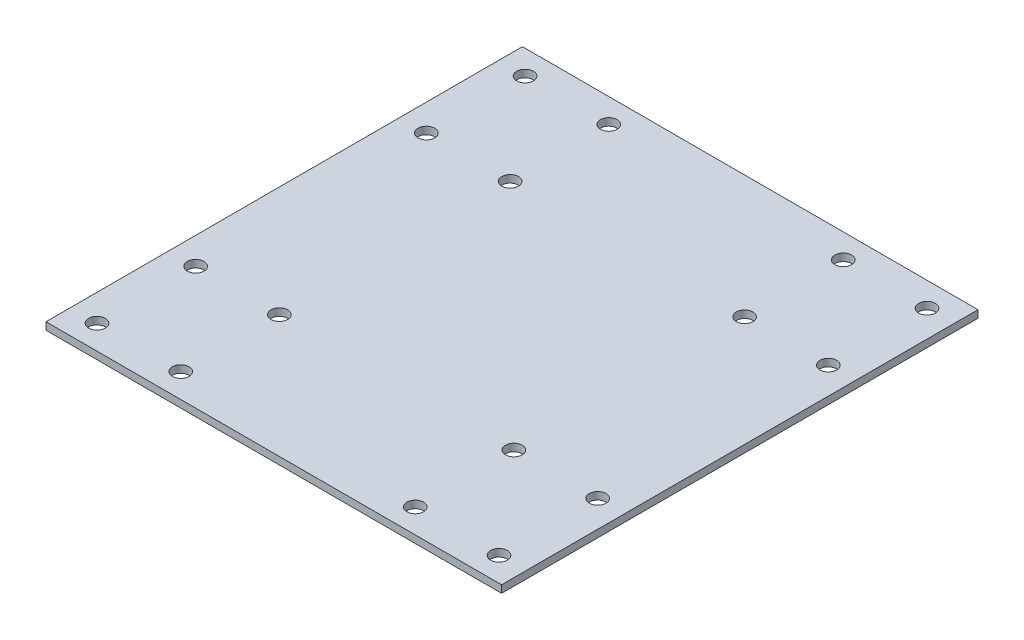
ISO-10303-21;
HEADER;
FILE_DESCRIPTION(('STEP AP214'),'2;1');
FILE_NAME('part.step','',(''),(''),'','','');
FILE_SCHEMA(('AUTOMOTIVE_DESIGN { 1 0 10303 214 1 1 1 1 }'));
ENDSEC;
DATA;
#1=APPLICATION_CONTEXT('core data for automotive mechanical design processes');
#2=APPLICATION_PROTOCOL_DEFINITION('international standard','automotive_design',2000,#1);
#3=PRODUCT_CONTEXT('',#1,'mechanical');
#4=PRODUCT('Part','Part','',(#3));
#5=PRODUCT_RELATED_PRODUCT_CATEGORY('part','',(#4));
#6=PRODUCT_DEFINITION_FORMATION('','',#4);
#7=PRODUCT_DEFINITION_CONTEXT('part definition',#1,'design');
#8=PRODUCT_DEFINITION('design','',#6,#7);
#9=PRODUCT_DEFINITION_SHAPE('','',#8);
#10=(LENGTH_UNIT() NAMED_UNIT(*) SI_UNIT(.MILLI.,.METRE.));
#11=(NAMED_UNIT(*) PLANE_ANGLE_UNIT() SI_UNIT($,.RADIAN.));
#12=(NAMED_UNIT(*) SI_UNIT($,.STERADIAN.) SOLID_ANGLE_UNIT());
#13=UNCERTAINTY_MEASURE_WITH_UNIT(LENGTH_MEASURE(1.E-05),#10,'distance_accuracy_value','');
#14=(GEOMETRIC_REPRESENTATION_CONTEXT(3) GLOBAL_UNCERTAINTY_ASSIGNED_CONTEXT((#13)) GLOBAL_UNIT_ASSIGNED_CONTEXT((#10,
#11,#12)) REPRESENTATION_CONTEXT('',''));
#15=CARTESIAN_POINT('',(0.,0.,0.));
#16=DIRECTION('',(0.,0.,1.));
#17=DIRECTION('',(1.,0.,0.));
#18=AXIS2_PLACEMENT_3D('',#15,#16,#17);
#19=CARTESIAN_POINT('',(194.31,6.35,203.2));
#20=DIRECTION('',(-1.,0.,0.));
#21=DIRECTION('',(0.,0.,1.));
#22=AXIS2_PLACEMENT_3D('',#19,#20,#21);
#23=PLANE('',#22);
#24=DIRECTION('',(0.,0.,-1.));
#25=VECTOR('',#24,1.);
#26=CARTESIAN_POINT('',(194.31,0.,203.2));
#27=LINE('',#26,#25);
#28=CARTESIAN_POINT('',(194.31,0.,203.2));
#29=VERTEX_POINT('',#28);
#30=CARTESIAN_POINT('',(194.31,0.,-203.2));
#31=VERTEX_POINT('',#30);
#32=EDGE_CURVE('E96',#29,#31,#27,.T.);
#33=ORIENTED_EDGE('',*,*,#32,.T.);
#34=DIRECTION('',(0.,-1.,0.));
#35=VECTOR('',#34,1.);
#36=CARTESIAN_POINT('',(194.31,6.35,-203.2));
#37=LINE('',#36,#35);
#38=CARTESIAN_POINT('',(194.31,6.35,-203.2));
#39=VERTEX_POINT('',#38);
#40=EDGE_CURVE('E11',#39,#31,#37,.T.);
#41=ORIENTED_EDGE('',*,*,#40,.F.);
#42=DIRECTION('',(0.,0.,-1.));
#43=VECTOR('',#42,1.);
#44=CARTESIAN_POINT('',(194.31,6.35,203.2));
#45=LINE('',#44,#43);
#46=CARTESIAN_POINT('',(194.31,6.35,203.2));
#47=VERTEX_POINT('',#46);
#48=EDGE_CURVE('E84',#47,#39,#45,.T.);
#49=ORIENTED_EDGE('',*,*,#48,.F.);
#50=DIRECTION('',(0.,-1.,0.));
#51=VECTOR('',#50,1.);
#52=CARTESIAN_POINT('',(194.31,6.35,203.2));
#53=LINE('',#52,#51);
#54=EDGE_CURVE('E92',#47,#29,#53,.T.);
#55=ORIENTED_EDGE('',*,*,#54,.T.);
#56=EDGE_LOOP('',(#33,#41,#49,#55));
#57=FACE_BOUND('',#56,.T.);
#58=ADVANCED_FACE('F33',(#57),#23,.F.);
#59=CARTESIAN_POINT('',(-194.31,6.35,-203.2));
#60=DIRECTION('',(0.,0.,1.));
#61=DIRECTION('',(1.,0.,0.));
#62=AXIS2_PLACEMENT_3D('',#59,#60,#61);
#63=PLANE('',#62);
#64=DIRECTION('',(-1.,0.,0.));
#65=VECTOR('',#64,1.);
#66=CARTESIAN_POINT('',(-194.31,0.,-203.2));
#67=LINE('',#66,#65);
#68=CARTESIAN_POINT('',(-194.31,0.,-203.2));
#69=VERTEX_POINT('',#68);
#70=EDGE_CURVE('E88',#31,#69,#67,.T.);
#71=ORIENTED_EDGE('',*,*,#70,.T.);
#72=DIRECTION('',(0.,-1.,0.));
#73=VECTOR('',#72,1.);
#74=CARTESIAN_POINT('',(-194.31,6.35,-203.2));
#75=LINE('',#74,#73);
#76=CARTESIAN_POINT('',(-194.31,6.35,-203.2));
#77=VERTEX_POINT('',#76);
#78=EDGE_CURVE('E41',#77,#69,#75,.T.);
#79=ORIENTED_EDGE('',*,*,#78,.F.);
#80=DIRECTION('',(-1.,0.,0.));
#81=VECTOR('',#80,1.);
#82=CARTESIAN_POINT('',(-194.31,6.35,-203.2));
#83=LINE('',#82,#81);
#84=EDGE_CURVE('E79',#39,#77,#83,.T.);
#85=ORIENTED_EDGE('',*,*,#84,.F.);
#86=ORIENTED_EDGE('',*,*,#40,.T.);
#87=EDGE_LOOP('',(#71,#79,#85,#86));
#88=FACE_BOUND('',#87,.T.);
#89=ADVANCED_FACE('F87',(#88),#63,.F.);
#90=CARTESIAN_POINT('',(-194.31,6.35,203.2));
#91=DIRECTION('',(1.,0.,0.));
#92=DIRECTION('',(0.,0.,-1.));
#93=AXIS2_PLACEMENT_3D('',#90,#91,#92);
#94=PLANE('',#93);
#95=DIRECTION('',(0.,0.,1.));
#96=VECTOR('',#95,1.);
#97=CARTESIAN_POINT('',(-194.31,0.,203.2));
#98=LINE('',#97,#96);
#99=CARTESIAN_POINT('',(-194.31,0.,203.2));
#100=VERTEX_POINT('',#99);
#101=EDGE_CURVE('E66',#69,#100,#98,.T.);
#102=ORIENTED_EDGE('',*,*,#101,.T.);
#103=DIRECTION('',(0.,-1.,0.));
#104=VECTOR('',#103,1.);
#105=CARTESIAN_POINT('',(-194.31,6.35,203.2));
#106=LINE('',#105,#104);
#107=CARTESIAN_POINT('',(-194.31,6.35,203.2));
#108=VERTEX_POINT('',#107);
#109=EDGE_CURVE('E89',#108,#100,#106,.T.);
#110=ORIENTED_EDGE('',*,*,#109,.F.);
#111=DIRECTION('',(0.,0.,1.));
#112=VECTOR('',#111,1.);
#113=CARTESIAN_POINT('',(-194.31,6.35,203.2));
#114=LINE('',#113,#112);
#115=EDGE_CURVE('E82',#77,#108,#114,.T.);
#116=ORIENTED_EDGE('',*,*,#115,.F.);
#117=ORIENTED_EDGE('',*,*,#78,.T.);
#118=EDGE_LOOP('',(#102,#110,#116,#117));
#119=FACE_BOUND('',#118,.T.);
#120=ADVANCED_FACE('F90',(#119),#94,.F.);
#121=CARTESIAN_POINT('',(-194.31,6.35,203.2));
#122=DIRECTION('',(0.,0.,-1.));
#123=DIRECTION('',(-1.,0.,0.));
#124=AXIS2_PLACEMENT_3D('',#121,#122,#123);
#125=PLANE('',#124);
#126=DIRECTION('',(1.,0.,0.));
#127=VECTOR('',#126,1.);
#128=CARTESIAN_POINT('',(-194.31,0.,203.2));
#129=LINE('',#128,#127);
#130=EDGE_CURVE('E72',#100,#29,#129,.T.);
#131=ORIENTED_EDGE('',*,*,#130,.T.);
#132=ORIENTED_EDGE('',*,*,#54,.F.);
#133=DIRECTION('',(1.,0.,0.));
#134=VECTOR('',#133,1.);
#135=CARTESIAN_POINT('',(-194.31,6.35,203.2));
#136=LINE('',#135,#134);
#137=EDGE_CURVE('E49',#108,#47,#136,.T.);
#138=ORIENTED_EDGE('',*,*,#137,.F.);
#139=ORIENTED_EDGE('',*,*,#109,.T.);
#140=EDGE_LOOP('',(#131,#132,#138,#139));
#141=FACE_BOUND('',#140,.T.);
#142=ADVANCED_FACE('F104',(#141),#125,.F.);
#143=CARTESIAN_POINT('',(0.,6.35,0.));
#144=DIRECTION('',(0.,-1.,0.));
#145=DIRECTION('',(0.,0.,-1.));
#146=AXIS2_PLACEMENT_3D('',#143,#144,#145);
#147=PLANE('',#146);
#148=CARTESIAN_POINT('',(171.45,6.35,98.425));
#149=DIRECTION('',(0.,1.,0.));
#150=DIRECTION('',(0.,0.,1.));
#151=AXIS2_PLACEMENT_3D('',#148,#149,#150);
#152=CIRCLE('',#151,7.14375000000002);
#153=CARTESIAN_POINT('',(171.45,6.35,105.56875));
#154=VERTEX_POINT('',#153);
#155=EDGE_CURVE('E200',#154,#154,#152,.T.);
#156=ORIENTED_EDGE('',*,*,#155,.F.);
#157=EDGE_LOOP('',(#156));
#158=FACE_BOUND('',#157,.T.);
#159=CARTESIAN_POINT('',(100.0125,6.35,98.425));
#160=DIRECTION('',(0.,1.,0.));
#161=DIRECTION('',(0.,0.,1.));
#162=AXIS2_PLACEMENT_3D('',#159,#160,#161);
#163=CIRCLE('',#162,7.14375);
#164=CARTESIAN_POINT('',(100.0125,6.35,105.56875));
#165=VERTEX_POINT('',#164);
#166=EDGE_CURVE('E194',#165,#165,#163,.T.);
#167=ORIENTED_EDGE('',*,*,#166,.F.);
#168=EDGE_LOOP('',(#167));
#169=FACE_BOUND('',#168,.T.);
#170=CARTESIAN_POINT('',(171.45,6.35,-98.425));
#171=DIRECTION('',(0.,1.,0.));
#172=DIRECTION('',(0.,0.,1.));
#173=AXIS2_PLACEMENT_3D('',#170,#171,#172);
#174=CIRCLE('',#173,7.14375000000002);
#175=CARTESIAN_POINT('',(171.45,6.35,-91.28125));
#176=VERTEX_POINT('',#175);
#177=EDGE_CURVE('E188',#176,#176,#174,.T.);
#178=ORIENTED_EDGE('',*,*,#177,.F.);
#179=EDGE_LOOP('',(#178));
#180=FACE_BOUND('',#179,.T.);
#181=CARTESIAN_POINT('',(100.0125,6.35,-98.425));
#182=DIRECTION('',(0.,1.,0.));
#183=DIRECTION('',(0.,0.,1.));
#184=AXIS2_PLACEMENT_3D('',#181,#182,#183);
#185=CIRCLE('',#184,7.14375000000002);
#186=CARTESIAN_POINT('',(100.0125,6.35,-91.28125));
#187=VERTEX_POINT('',#186);
#188=EDGE_CURVE('E182',#187,#187,#185,.T.);
#189=ORIENTED_EDGE('',*,*,#188,.F.);
#190=EDGE_LOOP('',(#189));
#191=FACE_BOUND('',#190,.T.);
#192=CARTESIAN_POINT('',(-100.0125,6.35,-98.425));
#193=DIRECTION('',(0.,1.,0.));
#194=DIRECTION('',(0.,0.,1.));
#195=AXIS2_PLACEMENT_3D('',#192,#193,#194);
#196=CIRCLE('',#195,7.14375);
#197=CARTESIAN_POINT('',(-100.0125,6.35,-91.28125));
#198=VERTEX_POINT('',#197);
#199=EDGE_CURVE('E176',#198,#198,#196,.T.);
#200=ORIENTED_EDGE('',*,*,#199,.F.);
#201=EDGE_LOOP('',(#200));
#202=FACE_BOUND('',#201,.T.);
#203=CARTESIAN_POINT('',(-100.0125,6.35,98.425));
#204=DIRECTION('',(0.,1.,0.));
#205=DIRECTION('',(0.,0.,1.));
#206=AXIS2_PLACEMENT_3D('',#203,#204,#205);
#207=CIRCLE('',#206,7.14375);
#208=CARTESIAN_POINT('',(-100.0125,6.35,105.56875));
#209=VERTEX_POINT('',#208);
#210=EDGE_CURVE('E170',#209,#209,#207,.T.);
#211=ORIENTED_EDGE('',*,*,#210,.F.);
#212=EDGE_LOOP('',(#211));
#213=FACE_BOUND('',#212,.T.);
#214=CARTESIAN_POINT('',(-171.45,6.35,-98.425));
#215=DIRECTION('',(0.,1.,0.));
#216=DIRECTION('',(0.,0.,1.));
#217=AXIS2_PLACEMENT_3D('',#214,#215,#216);
#218=CIRCLE('',#217,7.14375000000002);
#219=CARTESIAN_POINT('',(-171.45,6.35,-91.28125));
#220=VERTEX_POINT('',#219);
#221=EDGE_CURVE('E164',#220,#220,#218,.T.);
#222=ORIENTED_EDGE('',*,*,#221,.F.);
#223=EDGE_LOOP('',(#222));
#224=FACE_BOUND('',#223,.T.);
#225=CARTESIAN_POINT('',(-171.45,6.35,98.425));
#226=DIRECTION('',(0.,1.,0.));
#227=DIRECTION('',(0.,0.,1.));
#228=AXIS2_PLACEMENT_3D('',#225,#226,#227);
#229=CIRCLE('',#228,7.14375000000002);
#230=CARTESIAN_POINT('',(-171.45,6.35,105.56875));
#231=VERTEX_POINT('',#230);
#232=EDGE_CURVE('E158',#231,#231,#229,.T.);
#233=ORIENTED_EDGE('',*,*,#232,.F.);
#234=EDGE_LOOP('',(#233));
#235=FACE_BOUND('',#234,.T.);
#236=CARTESIAN_POINT('',(-100.0125,6.35,182.5625));
#237=DIRECTION('',(0.,1.,0.));
#238=DIRECTION('',(0.,0.,1.));
#239=AXIS2_PLACEMENT_3D('',#236,#237,#238);
#240=CIRCLE('',#239,7.14375);
#241=CARTESIAN_POINT('',(-100.0125,6.35,189.70625));
#242=VERTEX_POINT('',#241);
#243=EDGE_CURVE('E152',#242,#242,#240,.T.);
#244=ORIENTED_EDGE('',*,*,#243,.F.);
#245=EDGE_LOOP('',(#244));
#246=FACE_BOUND('',#245,.T.);
#247=CARTESIAN_POINT('',(171.45,6.35,-182.5625));
#248=DIRECTION('',(0.,1.,0.));
#249=DIRECTION('',(0.,0.,1.));
#250=AXIS2_PLACEMENT_3D('',#247,#248,#249);
#251=CIRCLE('',#250,7.14375000000001);
#252=CARTESIAN_POINT('',(171.45,6.35,-175.41875));
#253=VERTEX_POINT('',#252);
#254=EDGE_CURVE('E146',#253,#253,#251,.T.);
#255=ORIENTED_EDGE('',*,*,#254,.F.);
#256=EDGE_LOOP('',(#255));
#257=FACE_BOUND('',#256,.T.);
#258=CARTESIAN_POINT('',(100.0125,6.35,-182.5625));
#259=DIRECTION('',(0.,1.,0.));
#260=DIRECTION('',(0.,0.,1.));
#261=AXIS2_PLACEMENT_3D('',#258,#259,#260);
#262=CIRCLE('',#261,7.14375000000006);
#263=CARTESIAN_POINT('',(100.0125,6.35,-175.41875));
#264=VERTEX_POINT('',#263);
#265=EDGE_CURVE('E140',#264,#264,#262,.T.);
#266=ORIENTED_EDGE('',*,*,#265,.F.);
#267=EDGE_LOOP('',(#266));
#268=FACE_BOUND('',#267,.T.);
#269=CARTESIAN_POINT('',(-171.45,6.35,-182.5625));
#270=DIRECTION('',(0.,1.,0.));
#271=DIRECTION('',(0.,0.,1.));
#272=AXIS2_PLACEMENT_3D('',#269,#270,#271);
#273=CIRCLE('',#272,7.14375000000001);
#274=CARTESIAN_POINT('',(-171.45,6.35,-175.41875));
#275=VERTEX_POINT('',#274);
#276=EDGE_CURVE('E134',#275,#275,#273,.T.);
#277=ORIENTED_EDGE('',*,*,#276,.F.);
#278=EDGE_LOOP('',(#277));
#279=FACE_BOUND('',#278,.T.);
#280=CARTESIAN_POINT('',(171.45,6.35,182.5625));
#281=DIRECTION('',(0.,1.,0.));
#282=DIRECTION('',(0.,0.,1.));
#283=AXIS2_PLACEMENT_3D('',#280,#281,#282);
#284=CIRCLE('',#283,7.14375000000001);
#285=CARTESIAN_POINT('',(171.45,6.35,189.70625));
#286=VERTEX_POINT('',#285);
#287=EDGE_CURVE('E128',#286,#286,#284,.T.);
#288=ORIENTED_EDGE('',*,*,#287,.F.);
#289=EDGE_LOOP('',(#288));
#290=FACE_BOUND('',#289,.T.);
#291=CARTESIAN_POINT('',(100.0125,6.35,182.5625));
#292=DIRECTION('',(0.,1.,0.));
#293=DIRECTION('',(0.,0.,1.));
#294=AXIS2_PLACEMENT_3D('',#291,#292,#293);
#295=CIRCLE('',#294,7.14375000000003);
#296=CARTESIAN_POINT('',(100.0125,6.35,189.70625));
#297=VERTEX_POINT('',#296);
#298=EDGE_CURVE('E122',#297,#297,#295,.T.);
#299=ORIENTED_EDGE('',*,*,#298,.F.);
#300=EDGE_LOOP('',(#299));
#301=FACE_BOUND('',#300,.T.);
#302=CARTESIAN_POINT('',(-100.0125,6.35,-182.5625));
#303=DIRECTION('',(0.,1.,0.));
#304=DIRECTION('',(0.,0.,1.));
#305=AXIS2_PLACEMENT_3D('',#302,#303,#304);
#306=CIRCLE('',#305,7.14375);
#307=CARTESIAN_POINT('',(-100.0125,6.35,-175.41875));
#308=VERTEX_POINT('',#307);
#309=EDGE_CURVE('E116',#308,#308,#306,.T.);
#310=ORIENTED_EDGE('',*,*,#309,.F.);
#311=EDGE_LOOP('',(#310));
#312=FACE_BOUND('',#311,.T.);
#313=CARTESIAN_POINT('',(-171.45,6.35,182.5625));
#314=DIRECTION('',(0.,1.,0.));
#315=DIRECTION('',(0.,0.,1.));
#316=AXIS2_PLACEMENT_3D('',#313,#314,#315);
#317=CIRCLE('',#316,7.14375000000001);
#318=CARTESIAN_POINT('',(-171.45,6.35,189.70625));
#319=VERTEX_POINT('',#318);
#320=EDGE_CURVE('E110',#319,#319,#317,.T.);
#321=ORIENTED_EDGE('',*,*,#320,.F.);
#322=EDGE_LOOP('',(#321));
#323=FACE_BOUND('',#322,.T.);
#324=ORIENTED_EDGE('',*,*,#48,.T.);
#325=ORIENTED_EDGE('',*,*,#84,.T.);
#326=ORIENTED_EDGE('',*,*,#115,.T.);
#327=ORIENTED_EDGE('',*,*,#137,.T.);
#328=EDGE_LOOP('',(#324,#325,#326,#327));
#329=FACE_BOUND('',#328,.T.);
#330=ADVANCED_FACE('F80',(#158,#169,#180,#191,#202,#213,#224,#235,#246,#257,#268,#279,#290,#301,
#312,#323,#329),#147,.F.);
#331=CARTESIAN_POINT('',(0.,0.,0.));
#332=DIRECTION('',(0.,-1.,0.));
#333=DIRECTION('',(0.,0.,-1.));
#334=AXIS2_PLACEMENT_3D('',#331,#332,#333);
#335=PLANE('',#334);
#336=CARTESIAN_POINT('',(171.45,0.,98.425));
#337=DIRECTION('',(0.,1.,0.));
#338=DIRECTION('',(0.,0.,1.));
#339=AXIS2_PLACEMENT_3D('',#336,#337,#338);
#340=CIRCLE('',#339,7.14375000000002);
#341=CARTESIAN_POINT('',(171.45,0.,105.56875));
#342=VERTEX_POINT('',#341);
#343=EDGE_CURVE('E197',#342,#342,#340,.T.);
#344=ORIENTED_EDGE('',*,*,#343,.T.);
#345=EDGE_LOOP('',(#344));
#346=FACE_BOUND('',#345,.T.);
#347=CARTESIAN_POINT('',(100.0125,0.,98.425));
#348=DIRECTION('',(0.,1.,0.));
#349=DIRECTION('',(0.,0.,1.));
#350=AXIS2_PLACEMENT_3D('',#347,#348,#349);
#351=CIRCLE('',#350,7.14375);
#352=CARTESIAN_POINT('',(100.0125,0.,105.56875));
#353=VERTEX_POINT('',#352);
#354=EDGE_CURVE('E191',#353,#353,#351,.T.);
#355=ORIENTED_EDGE('',*,*,#354,.T.);
#356=EDGE_LOOP('',(#355));
#357=FACE_BOUND('',#356,.T.);
#358=CARTESIAN_POINT('',(171.45,0.,-98.425));
#359=DIRECTION('',(0.,1.,0.));
#360=DIRECTION('',(0.,0.,1.));
#361=AXIS2_PLACEMENT_3D('',#358,#359,#360);
#362=CIRCLE('',#361,7.14375000000002);
#363=CARTESIAN_POINT('',(171.45,0.,-91.28125));
#364=VERTEX_POINT('',#363);
#365=EDGE_CURVE('E185',#364,#364,#362,.T.);
#366=ORIENTED_EDGE('',*,*,#365,.T.);
#367=EDGE_LOOP('',(#366));
#368=FACE_BOUND('',#367,.T.);
#369=CARTESIAN_POINT('',(100.0125,0.,-98.425));
#370=DIRECTION('',(0.,1.,0.));
#371=DIRECTION('',(0.,0.,1.));
#372=AXIS2_PLACEMENT_3D('',#369,#370,#371);
#373=CIRCLE('',#372,7.14375000000002);
#374=CARTESIAN_POINT('',(100.0125,0.,-91.28125));
#375=VERTEX_POINT('',#374);
#376=EDGE_CURVE('E179',#375,#375,#373,.T.);
#377=ORIENTED_EDGE('',*,*,#376,.T.);
#378=EDGE_LOOP('',(#377));
#379=FACE_BOUND('',#378,.T.);
#380=CARTESIAN_POINT('',(-100.0125,0.,-98.425));
#381=DIRECTION('',(0.,1.,0.));
#382=DIRECTION('',(0.,0.,1.));
#383=AXIS2_PLACEMENT_3D('',#380,#381,#382);
#384=CIRCLE('',#383,7.14375);
#385=CARTESIAN_POINT('',(-100.0125,0.,-91.28125));
#386=VERTEX_POINT('',#385);
#387=EDGE_CURVE('E173',#386,#386,#384,.T.);
#388=ORIENTED_EDGE('',*,*,#387,.T.);
#389=EDGE_LOOP('',(#388));
#390=FACE_BOUND('',#389,.T.);
#391=CARTESIAN_POINT('',(-100.0125,0.,98.425));
#392=DIRECTION('',(0.,1.,0.));
#393=DIRECTION('',(0.,0.,1.));
#394=AXIS2_PLACEMENT_3D('',#391,#392,#393);
#395=CIRCLE('',#394,7.14375);
#396=CARTESIAN_POINT('',(-100.0125,0.,105.56875));
#397=VERTEX_POINT('',#396);
#398=EDGE_CURVE('E167',#397,#397,#395,.T.);
#399=ORIENTED_EDGE('',*,*,#398,.T.);
#400=EDGE_LOOP('',(#399));
#401=FACE_BOUND('',#400,.T.);
#402=CARTESIAN_POINT('',(-171.45,0.,-98.425));
#403=DIRECTION('',(0.,1.,0.));
#404=DIRECTION('',(0.,0.,1.));
#405=AXIS2_PLACEMENT_3D('',#402,#403,#404);
#406=CIRCLE('',#405,7.14375000000002);
#407=CARTESIAN_POINT('',(-171.45,0.,-91.28125));
#408=VERTEX_POINT('',#407);
#409=EDGE_CURVE('E161',#408,#408,#406,.T.);
#410=ORIENTED_EDGE('',*,*,#409,.T.);
#411=EDGE_LOOP('',(#410));
#412=FACE_BOUND('',#411,.T.);
#413=CARTESIAN_POINT('',(-171.45,0.,98.425));
#414=DIRECTION('',(0.,1.,0.));
#415=DIRECTION('',(0.,0.,1.));
#416=AXIS2_PLACEMENT_3D('',#413,#414,#415);
#417=CIRCLE('',#416,7.14375000000002);
#418=CARTESIAN_POINT('',(-171.45,0.,105.56875));
#419=VERTEX_POINT('',#418);
#420=EDGE_CURVE('E155',#419,#419,#417,.T.);
#421=ORIENTED_EDGE('',*,*,#420,.T.);
#422=EDGE_LOOP('',(#421));
#423=FACE_BOUND('',#422,.T.);
#424=CARTESIAN_POINT('',(-100.0125,0.,182.5625));
#425=DIRECTION('',(0.,1.,0.));
#426=DIRECTION('',(0.,0.,1.));
#427=AXIS2_PLACEMENT_3D('',#424,#425,#426);
#428=CIRCLE('',#427,7.14375);
#429=CARTESIAN_POINT('',(-100.0125,0.,189.70625));
#430=VERTEX_POINT('',#429);
#431=EDGE_CURVE('E149',#430,#430,#428,.T.);
#432=ORIENTED_EDGE('',*,*,#431,.T.);
#433=EDGE_LOOP('',(#432));
#434=FACE_BOUND('',#433,.T.);
#435=CARTESIAN_POINT('',(171.45,0.,-182.5625));
#436=DIRECTION('',(0.,1.,0.));
#437=DIRECTION('',(0.,0.,1.));
#438=AXIS2_PLACEMENT_3D('',#435,#436,#437);
#439=CIRCLE('',#438,7.14375000000001);
#440=CARTESIAN_POINT('',(171.45,0.,-175.41875));
#441=VERTEX_POINT('',#440);
#442=EDGE_CURVE('E143',#441,#441,#439,.T.);
#443=ORIENTED_EDGE('',*,*,#442,.T.);
#444=EDGE_LOOP('',(#443));
#445=FACE_BOUND('',#444,.T.);
#446=CARTESIAN_POINT('',(100.0125,0.,-182.5625));
#447=DIRECTION('',(0.,1.,0.));
#448=DIRECTION('',(0.,0.,1.));
#449=AXIS2_PLACEMENT_3D('',#446,#447,#448);
#450=CIRCLE('',#449,7.14375000000006);
#451=CARTESIAN_POINT('',(100.0125,0.,-175.41875));
#452=VERTEX_POINT('',#451);
#453=EDGE_CURVE('E137',#452,#452,#450,.T.);
#454=ORIENTED_EDGE('',*,*,#453,.T.);
#455=EDGE_LOOP('',(#454));
#456=FACE_BOUND('',#455,.T.);
#457=CARTESIAN_POINT('',(-171.45,0.,-182.5625));
#458=DIRECTION('',(0.,1.,0.));
#459=DIRECTION('',(0.,0.,1.));
#460=AXIS2_PLACEMENT_3D('',#457,#458,#459);
#461=CIRCLE('',#460,7.14375000000001);
#462=CARTESIAN_POINT('',(-171.45,0.,-175.41875));
#463=VERTEX_POINT('',#462);
#464=EDGE_CURVE('E131',#463,#463,#461,.T.);
#465=ORIENTED_EDGE('',*,*,#464,.T.);
#466=EDGE_LOOP('',(#465));
#467=FACE_BOUND('',#466,.T.);
#468=CARTESIAN_POINT('',(171.45,0.,182.5625));
#469=DIRECTION('',(0.,1.,0.));
#470=DIRECTION('',(0.,0.,1.));
#471=AXIS2_PLACEMENT_3D('',#468,#469,#470);
#472=CIRCLE('',#471,7.14375000000001);
#473=CARTESIAN_POINT('',(171.45,0.,189.70625));
#474=VERTEX_POINT('',#473);
#475=EDGE_CURVE('E125',#474,#474,#472,.T.);
#476=ORIENTED_EDGE('',*,*,#475,.T.);
#477=EDGE_LOOP('',(#476));
#478=FACE_BOUND('',#477,.T.);
#479=CARTESIAN_POINT('',(100.0125,0.,182.5625));
#480=DIRECTION('',(0.,1.,0.));
#481=DIRECTION('',(0.,0.,1.));
#482=AXIS2_PLACEMENT_3D('',#479,#480,#481);
#483=CIRCLE('',#482,7.14375000000003);
#484=CARTESIAN_POINT('',(100.0125,0.,189.70625));
#485=VERTEX_POINT('',#484);
#486=EDGE_CURVE('E119',#485,#485,#483,.T.);
#487=ORIENTED_EDGE('',*,*,#486,.T.);
#488=EDGE_LOOP('',(#487));
#489=FACE_BOUND('',#488,.T.);
#490=CARTESIAN_POINT('',(-100.0125,0.,-182.5625));
#491=DIRECTION('',(0.,1.,0.));
#492=DIRECTION('',(0.,0.,1.));
#493=AXIS2_PLACEMENT_3D('',#490,#491,#492);
#494=CIRCLE('',#493,7.14375);
#495=CARTESIAN_POINT('',(-100.0125,0.,-175.41875));
#496=VERTEX_POINT('',#495);
#497=EDGE_CURVE('E113',#496,#496,#494,.T.);
#498=ORIENTED_EDGE('',*,*,#497,.T.);
#499=EDGE_LOOP('',(#498));
#500=FACE_BOUND('',#499,.T.);
#501=CARTESIAN_POINT('',(-171.45,0.,182.5625));
#502=DIRECTION('',(0.,1.,0.));
#503=DIRECTION('',(0.,0.,1.));
#504=AXIS2_PLACEMENT_3D('',#501,#502,#503);
#505=CIRCLE('',#504,7.14375000000001);
#506=CARTESIAN_POINT('',(-171.45,0.,189.70625));
#507=VERTEX_POINT('',#506);
#508=EDGE_CURVE('E99',#507,#507,#505,.T.);
#509=ORIENTED_EDGE('',*,*,#508,.T.);
#510=EDGE_LOOP('',(#509));
#511=FACE_BOUND('',#510,.T.);
#512=ORIENTED_EDGE('',*,*,#32,.F.);
#513=ORIENTED_EDGE('',*,*,#130,.F.);
#514=ORIENTED_EDGE('',*,*,#101,.F.);
#515=ORIENTED_EDGE('',*,*,#70,.F.);
#516=EDGE_LOOP('',(#512,#513,#514,#515));
#517=FACE_BOUND('',#516,.T.);
#518=ADVANCED_FACE('F107',(#346,#357,#368,#379,#390,#401,#412,#423,#434,#445,#456,#467,#478,
#489,#500,#511,#517),#335,.T.);
#519=CARTESIAN_POINT('',(-171.45,0.,182.5625));
#520=DIRECTION('',(0.,1.,0.));
#521=DIRECTION('',(0.,0.,1.));
#522=AXIS2_PLACEMENT_3D('',#519,#520,#521);
#523=CYLINDRICAL_SURFACE('',#522,7.14375000000001);
#524=ORIENTED_EDGE('',*,*,#508,.F.);
#525=EDGE_LOOP('',(#524));
#526=FACE_BOUND('',#525,.T.);
#527=ORIENTED_EDGE('',*,*,#320,.T.);
#528=EDGE_LOOP('',(#527));
#529=FACE_BOUND('',#528,.T.);
#530=ADVANCED_FACE('F248',(#526,#529),#523,.F.);
#531=CARTESIAN_POINT('',(-100.0125,0.,-182.5625));
#532=DIRECTION('',(0.,1.,0.));
#533=DIRECTION('',(0.,0.,1.));
#534=AXIS2_PLACEMENT_3D('',#531,#532,#533);
#535=CYLINDRICAL_SURFACE('',#534,7.14375);
#536=ORIENTED_EDGE('',*,*,#497,.F.);
#537=EDGE_LOOP('',(#536));
#538=FACE_BOUND('',#537,.T.);
#539=ORIENTED_EDGE('',*,*,#309,.T.);
#540=EDGE_LOOP('',(#539));
#541=FACE_BOUND('',#540,.T.);
#542=ADVANCED_FACE('F250',(#538,#541),#535,.F.);
#543=CARTESIAN_POINT('',(100.0125,0.,182.5625));
#544=DIRECTION('',(0.,1.,0.));
#545=DIRECTION('',(0.,0.,1.));
#546=AXIS2_PLACEMENT_3D('',#543,#544,#545);
#547=CYLINDRICAL_SURFACE('',#546,7.14375000000003);
#548=ORIENTED_EDGE('',*,*,#486,.F.);
#549=EDGE_LOOP('',(#548));
#550=FACE_BOUND('',#549,.T.);
#551=ORIENTED_EDGE('',*,*,#298,.T.);
#552=EDGE_LOOP('',(#551));
#553=FACE_BOUND('',#552,.T.);
#554=ADVANCED_FACE('F257',(#550,#553),#547,.F.);
#555=CARTESIAN_POINT('',(171.45,0.,182.5625));
#556=DIRECTION('',(0.,1.,0.));
#557=DIRECTION('',(0.,0.,1.));
#558=AXIS2_PLACEMENT_3D('',#555,#556,#557);
#559=CYLINDRICAL_SURFACE('',#558,7.14375000000001);
#560=ORIENTED_EDGE('',*,*,#475,.F.);
#561=EDGE_LOOP('',(#560));
#562=FACE_BOUND('',#561,.T.);
#563=ORIENTED_EDGE('',*,*,#287,.T.);
#564=EDGE_LOOP('',(#563));
#565=FACE_BOUND('',#564,.T.);
#566=ADVANCED_FACE('F303',(#562,#565),#559,.F.);
#567=CARTESIAN_POINT('',(-171.45,0.,-182.5625));
#568=DIRECTION('',(0.,1.,0.));
#569=DIRECTION('',(0.,0.,1.));
#570=AXIS2_PLACEMENT_3D('',#567,#568,#569);
#571=CYLINDRICAL_SURFACE('',#570,7.14375000000001);
#572=ORIENTED_EDGE('',*,*,#464,.F.);
#573=EDGE_LOOP('',(#572));
#574=FACE_BOUND('',#573,.T.);
#575=ORIENTED_EDGE('',*,*,#276,.T.);
#576=EDGE_LOOP('',(#575));
#577=FACE_BOUND('',#576,.T.);
#578=ADVANCED_FACE('F313',(#574,#577),#571,.F.);
#579=CARTESIAN_POINT('',(100.0125,0.,-182.5625));
#580=DIRECTION('',(0.,1.,0.));
#581=DIRECTION('',(0.,0.,1.));
#582=AXIS2_PLACEMENT_3D('',#579,#580,#581);
#583=CYLINDRICAL_SURFACE('',#582,7.14375000000006);
#584=ORIENTED_EDGE('',*,*,#453,.F.);
#585=EDGE_LOOP('',(#584));
#586=FACE_BOUND('',#585,.T.);
#587=ORIENTED_EDGE('',*,*,#265,.T.);
#588=EDGE_LOOP('',(#587));
#589=FACE_BOUND('',#588,.T.);
#590=ADVANCED_FACE('F323',(#586,#589),#583,.F.);
#591=CARTESIAN_POINT('',(171.45,0.,-182.5625));
#592=DIRECTION('',(0.,1.,0.));
#593=DIRECTION('',(0.,0.,1.));
#594=AXIS2_PLACEMENT_3D('',#591,#592,#593);
#595=CYLINDRICAL_SURFACE('',#594,7.14375000000001);
#596=ORIENTED_EDGE('',*,*,#442,.F.);
#597=EDGE_LOOP('',(#596));
#598=FACE_BOUND('',#597,.T.);
#599=ORIENTED_EDGE('',*,*,#254,.T.);
#600=EDGE_LOOP('',(#599));
#601=FACE_BOUND('',#600,.T.);
#602=ADVANCED_FACE('F333',(#598,#601),#595,.F.);
#603=CARTESIAN_POINT('',(-100.0125,0.,182.5625));
#604=DIRECTION('',(0.,1.,0.));
#605=DIRECTION('',(0.,0.,1.));
#606=AXIS2_PLACEMENT_3D('',#603,#604,#605);
#607=CYLINDRICAL_SURFACE('',#606,7.14375);
#608=ORIENTED_EDGE('',*,*,#431,.F.);
#609=EDGE_LOOP('',(#608));
#610=FACE_BOUND('',#609,.T.);
#611=ORIENTED_EDGE('',*,*,#243,.T.);
#612=EDGE_LOOP('',(#611));
#613=FACE_BOUND('',#612,.T.);
#614=ADVANCED_FACE('F343',(#610,#613),#607,.F.);
#615=CARTESIAN_POINT('',(-171.45,0.,98.425));
#616=DIRECTION('',(0.,1.,0.));
#617=DIRECTION('',(0.,0.,1.));
#618=AXIS2_PLACEMENT_3D('',#615,#616,#617);
#619=CYLINDRICAL_SURFACE('',#618,7.14375000000002);
#620=ORIENTED_EDGE('',*,*,#420,.F.);
#621=EDGE_LOOP('',(#620));
#622=FACE_BOUND('',#621,.T.);
#623=ORIENTED_EDGE('',*,*,#232,.T.);
#624=EDGE_LOOP('',(#623));
#625=FACE_BOUND('',#624,.T.);
#626=ADVANCED_FACE('F353',(#622,#625),#619,.F.);
#627=CARTESIAN_POINT('',(-171.45,0.,-98.425));
#628=DIRECTION('',(0.,1.,0.));
#629=DIRECTION('',(0.,0.,1.));
#630=AXIS2_PLACEMENT_3D('',#627,#628,#629);
#631=CYLINDRICAL_SURFACE('',#630,7.14375000000002);
#632=ORIENTED_EDGE('',*,*,#409,.F.);
#633=EDGE_LOOP('',(#632));
#634=FACE_BOUND('',#633,.T.);
#635=ORIENTED_EDGE('',*,*,#221,.T.);
#636=EDGE_LOOP('',(#635));
#637=FACE_BOUND('',#636,.T.);
#638=ADVANCED_FACE('F363',(#634,#637),#631,.F.);
#639=CARTESIAN_POINT('',(-100.0125,0.,98.425));
#640=DIRECTION('',(0.,1.,0.));
#641=DIRECTION('',(0.,0.,1.));
#642=AXIS2_PLACEMENT_3D('',#639,#640,#641);
#643=CYLINDRICAL_SURFACE('',#642,7.14375);
#644=ORIENTED_EDGE('',*,*,#398,.F.);
#645=EDGE_LOOP('',(#644));
#646=FACE_BOUND('',#645,.T.);
#647=ORIENTED_EDGE('',*,*,#210,.T.);
#648=EDGE_LOOP('',(#647));
#649=FACE_BOUND('',#648,.T.);
#650=ADVANCED_FACE('F373',(#646,#649),#643,.F.);
#651=CARTESIAN_POINT('',(-100.0125,0.,-98.425));
#652=DIRECTION('',(0.,1.,0.));
#653=DIRECTION('',(0.,0.,1.));
#654=AXIS2_PLACEMENT_3D('',#651,#652,#653);
#655=CYLINDRICAL_SURFACE('',#654,7.14375);
#656=ORIENTED_EDGE('',*,*,#387,.F.);
#657=EDGE_LOOP('',(#656));
#658=FACE_BOUND('',#657,.T.);
#659=ORIENTED_EDGE('',*,*,#199,.T.);
#660=EDGE_LOOP('',(#659));
#661=FACE_BOUND('',#660,.T.);
#662=ADVANCED_FACE('F383',(#658,#661),#655,.F.);
#663=CARTESIAN_POINT('',(100.0125,0.,-98.425));
#664=DIRECTION('',(0.,1.,0.));
#665=DIRECTION('',(0.,0.,1.));
#666=AXIS2_PLACEMENT_3D('',#663,#664,#665);
#667=CYLINDRICAL_SURFACE('',#666,7.14375000000002);
#668=ORIENTED_EDGE('',*,*,#376,.F.);
#669=EDGE_LOOP('',(#668));
#670=FACE_BOUND('',#669,.T.);
#671=ORIENTED_EDGE('',*,*,#188,.T.);
#672=EDGE_LOOP('',(#671));
#673=FACE_BOUND('',#672,.T.);
#674=ADVANCED_FACE('F393',(#670,#673),#667,.F.);
#675=CARTESIAN_POINT('',(171.45,0.,-98.425));
#676=DIRECTION('',(0.,1.,0.));
#677=DIRECTION('',(0.,0.,1.));
#678=AXIS2_PLACEMENT_3D('',#675,#676,#677);
#679=CYLINDRICAL_SURFACE('',#678,7.14375000000002);
#680=ORIENTED_EDGE('',*,*,#365,.F.);
#681=EDGE_LOOP('',(#680));
#682=FACE_BOUND('',#681,.T.);
#683=ORIENTED_EDGE('',*,*,#177,.T.);
#684=EDGE_LOOP('',(#683));
#685=FACE_BOUND('',#684,.T.);
#686=ADVANCED_FACE('F403',(#682,#685),#679,.F.);
#687=CARTESIAN_POINT('',(100.0125,0.,98.425));
#688=DIRECTION('',(0.,1.,0.));
#689=DIRECTION('',(0.,0.,1.));
#690=AXIS2_PLACEMENT_3D('',#687,#688,#689);
#691=CYLINDRICAL_SURFACE('',#690,7.14375);
#692=ORIENTED_EDGE('',*,*,#354,.F.);
#693=EDGE_LOOP('',(#692));
#694=FACE_BOUND('',#693,.T.);
#695=ORIENTED_EDGE('',*,*,#166,.T.);
#696=EDGE_LOOP('',(#695));
#697=FACE_BOUND('',#696,.T.);
#698=ADVANCED_FACE('F211',(#694,#697),#691,.F.);
#699=CARTESIAN_POINT('',(171.45,0.,98.425));
#700=DIRECTION('',(0.,1.,0.));
#701=DIRECTION('',(0.,0.,1.));
#702=AXIS2_PLACEMENT_3D('',#699,#700,#701);
#703=CYLINDRICAL_SURFACE('',#702,7.14375000000002);
#704=ORIENTED_EDGE('',*,*,#343,.F.);
#705=EDGE_LOOP('',(#704));
#706=FACE_BOUND('',#705,.T.);
#707=ORIENTED_EDGE('',*,*,#155,.T.);
#708=EDGE_LOOP('',(#707));
#709=FACE_BOUND('',#708,.T.);
#710=ADVANCED_FACE('F208',(#706,#709),#703,.F.);
#711=CLOSED_SHELL('',(#58,#89,#120,#142,#330,#518,#530,#542,#554,#566,#578,#590,#602,#614,#626,
#638,#650,#662,#674,#686,#698,#710));
#712=MANIFOLD_SOLID_BREP('B2',#711);
#713=ADVANCED_BREP_SHAPE_REPRESENTATION('',(#18,#712),#14);
#714=SHAPE_DEFINITION_REPRESENTATION(#9,#713);
ENDSEC;
END-ISO-10303-21;
